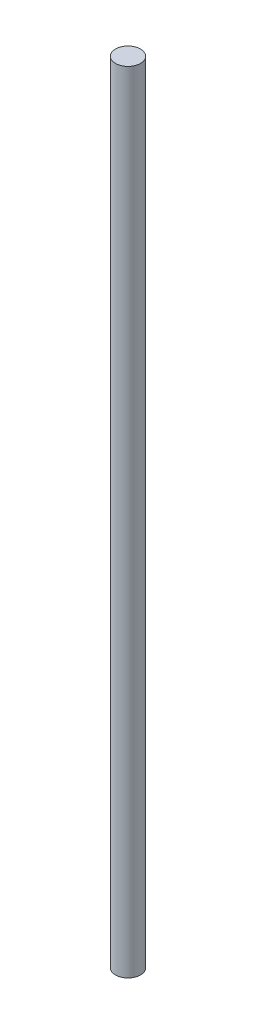
ISO-10303-21;
HEADER;
FILE_DESCRIPTION(('STEP AP214'),'2;1');
FILE_NAME('part.step','',(''),(''),'','','');
FILE_SCHEMA(('AUTOMOTIVE_DESIGN { 1 0 10303 214 1 1 1 1 }'));
ENDSEC;
DATA;
#1=APPLICATION_CONTEXT('core data for automotive mechanical design processes');
#2=APPLICATION_PROTOCOL_DEFINITION('international standard','automotive_design',2000,#1);
#3=PRODUCT_CONTEXT('',#1,'mechanical');
#4=PRODUCT('Part','Part','',(#3));
#5=PRODUCT_RELATED_PRODUCT_CATEGORY('part','',(#4));
#6=PRODUCT_DEFINITION_FORMATION('','',#4);
#7=PRODUCT_DEFINITION_CONTEXT('part definition',#1,'design');
#8=PRODUCT_DEFINITION('design','',#6,#7);
#9=PRODUCT_DEFINITION_SHAPE('','',#8);
#10=(LENGTH_UNIT() NAMED_UNIT(*) SI_UNIT(.MILLI.,.METRE.));
#11=(NAMED_UNIT(*) PLANE_ANGLE_UNIT() SI_UNIT($,.RADIAN.));
#12=(NAMED_UNIT(*) SI_UNIT($,.STERADIAN.) SOLID_ANGLE_UNIT());
#13=UNCERTAINTY_MEASURE_WITH_UNIT(LENGTH_MEASURE(1.E-05),#10,'distance_accuracy_value','');
#14=(GEOMETRIC_REPRESENTATION_CONTEXT(3) GLOBAL_UNCERTAINTY_ASSIGNED_CONTEXT((#13)) GLOBAL_UNIT_ASSIGNED_CONTEXT((#10,
#11,#12)) REPRESENTATION_CONTEXT('',''));
#15=CARTESIAN_POINT('',(0.,0.,0.));
#16=DIRECTION('',(0.,0.,1.));
#17=DIRECTION('',(1.,0.,0.));
#18=AXIS2_PLACEMENT_3D('',#15,#16,#17);
#19=CARTESIAN_POINT('',(0.,175.071067811866,0.));
#20=DIRECTION('',(0.,-1.,0.));
#21=DIRECTION('',(0.,0.,-1.));
#22=AXIS2_PLACEMENT_3D('',#19,#20,#21);
#23=CYLINDRICAL_SURFACE('',#22,2.5);
#24=CARTESIAN_POINT('',(0.,0.,0.));
#25=DIRECTION('',(0.,1.,0.));
#26=DIRECTION('',(0.,0.,1.));
#27=AXIS2_PLACEMENT_3D('',#24,#25,#26);
#28=CIRCLE('',#27,2.5);
#29=CARTESIAN_POINT('',(0.,0.,2.5));
#30=VERTEX_POINT('',#29);
#31=EDGE_CURVE('E40',#30,#30,#28,.T.);
#32=ORIENTED_EDGE('',*,*,#31,.T.);
#33=EDGE_LOOP('',(#32));
#34=FACE_BOUND('',#33,.T.);
#35=CARTESIAN_POINT('',(0.,158.,0.));
#36=DIRECTION('',(0.,1.,0.));
#37=DIRECTION('',(0.,0.,1.));
#38=AXIS2_PLACEMENT_3D('',#35,#36,#37);
#39=CIRCLE('',#38,2.5);
#40=CARTESIAN_POINT('',(0.,158.,2.5));
#41=VERTEX_POINT('',#40);
#42=EDGE_CURVE('E10',#41,#41,#39,.T.);
#43=ORIENTED_EDGE('',*,*,#42,.F.);
#44=EDGE_LOOP('',(#43));
#45=FACE_BOUND('',#44,.T.);
#46=ADVANCED_FACE('F33',(#34,#45),#23,.T.);
#47=CARTESIAN_POINT('',(0.,0.,0.));
#48=DIRECTION('',(0.,1.,0.));
#49=DIRECTION('',(0.,0.,1.));
#50=AXIS2_PLACEMENT_3D('',#47,#48,#49);
#51=PLANE('',#50);
#52=ORIENTED_EDGE('',*,*,#31,.F.);
#53=EDGE_LOOP('',(#52));
#54=FACE_BOUND('',#53,.T.);
#55=ADVANCED_FACE('F48',(#54),#51,.F.);
#56=CARTESIAN_POINT('',(-77.4980948659119,158.,-62.5005423362659));
#57=DIRECTION('',(0.,1.,0.));
#58=DIRECTION('',(0.635240639452666,0.,0.77231426892669));
#59=AXIS2_PLACEMENT_3D('',#56,#57,#58);
#60=PLANE('',#59);
#61=ORIENTED_EDGE('',*,*,#42,.T.);
#62=EDGE_LOOP('',(#61));
#63=FACE_BOUND('',#62,.T.);
#64=ADVANCED_FACE('F35',(#63),#60,.T.);
#65=CLOSED_SHELL('',(#46,#55,#64));
#66=MANIFOLD_SOLID_BREP('B2',#65);
#67=ADVANCED_BREP_SHAPE_REPRESENTATION('',(#18,#66),#14);
#68=SHAPE_DEFINITION_REPRESENTATION(#9,#67);
ENDSEC;
END-ISO-10303-21;
